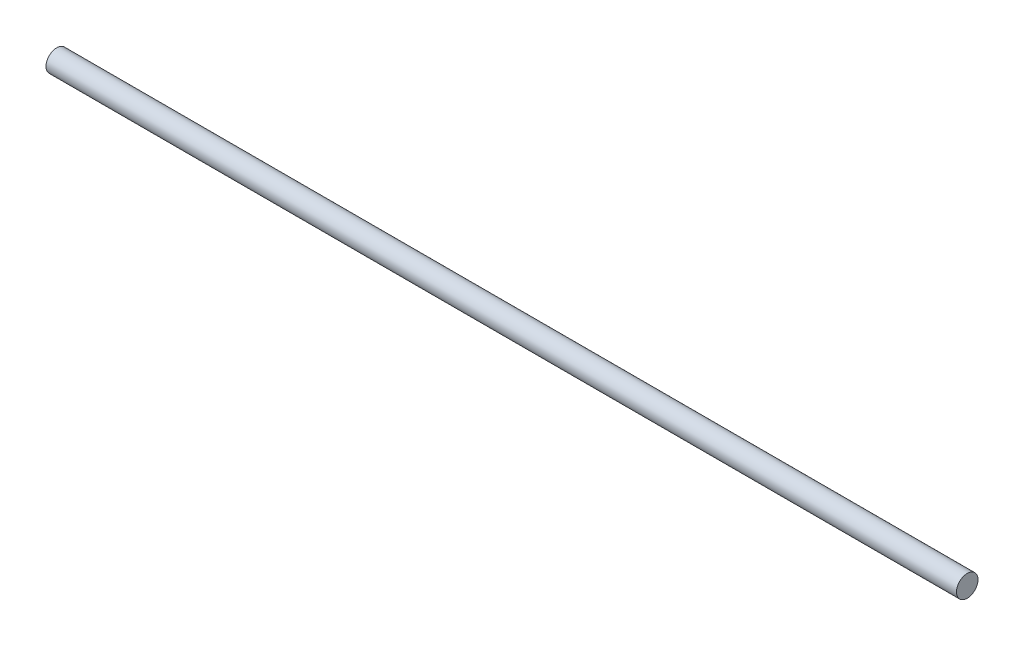
ISO-10303-21;
HEADER;
FILE_DESCRIPTION(('STEP AP214'),'2;1');
FILE_NAME('part.step','',(''),(''),'','','');
FILE_SCHEMA(('AUTOMOTIVE_DESIGN { 1 0 10303 214 1 1 1 1 }'));
ENDSEC;
DATA;
#1=APPLICATION_CONTEXT('core data for automotive mechanical design processes');
#2=APPLICATION_PROTOCOL_DEFINITION('international standard','automotive_design',2000,#1);
#3=PRODUCT_CONTEXT('',#1,'mechanical');
#4=PRODUCT('Part','Part','',(#3));
#5=PRODUCT_RELATED_PRODUCT_CATEGORY('part','',(#4));
#6=PRODUCT_DEFINITION_FORMATION('','',#4);
#7=PRODUCT_DEFINITION_CONTEXT('part definition',#1,'design');
#8=PRODUCT_DEFINITION('design','',#6,#7);
#9=PRODUCT_DEFINITION_SHAPE('','',#8);
#10=(LENGTH_UNIT() NAMED_UNIT(*) SI_UNIT(.MILLI.,.METRE.));
#11=(NAMED_UNIT(*) PLANE_ANGLE_UNIT() SI_UNIT($,.RADIAN.));
#12=(NAMED_UNIT(*) SI_UNIT($,.STERADIAN.) SOLID_ANGLE_UNIT());
#13=UNCERTAINTY_MEASURE_WITH_UNIT(LENGTH_MEASURE(1.E-05),#10,'distance_accuracy_value','');
#14=(GEOMETRIC_REPRESENTATION_CONTEXT(3) GLOBAL_UNCERTAINTY_ASSIGNED_CONTEXT((#13)) GLOBAL_UNIT_ASSIGNED_CONTEXT((#10,
#11,#12)) REPRESENTATION_CONTEXT('',''));
#15=CARTESIAN_POINT('',(0.,0.,0.));
#16=DIRECTION('',(0.,0.,1.));
#17=DIRECTION('',(1.,0.,0.));
#18=AXIS2_PLACEMENT_3D('',#15,#16,#17);
#19=CARTESIAN_POINT('',(338.,0.,0.));
#20=DIRECTION('',(-1.,0.,0.));
#21=DIRECTION('',(0.,0.,1.));
#22=AXIS2_PLACEMENT_3D('',#19,#20,#21);
#23=CYLINDRICAL_SURFACE('',#22,4.);
#24=CARTESIAN_POINT('',(338.,0.,0.));
#25=DIRECTION('',(1.,0.,0.));
#26=DIRECTION('',(0.,0.,-1.));
#27=AXIS2_PLACEMENT_3D('',#24,#25,#26);
#28=CIRCLE('',#27,4.);
#29=CARTESIAN_POINT('',(338.,0.,-4.));
#30=VERTEX_POINT('',#29);
#31=EDGE_CURVE('E10',#30,#30,#28,.T.);
#32=ORIENTED_EDGE('',*,*,#31,.F.);
#33=EDGE_LOOP('',(#32));
#34=FACE_BOUND('',#33,.T.);
#35=CARTESIAN_POINT('',(0.,0.,0.));
#36=DIRECTION('',(1.,0.,0.));
#37=DIRECTION('',(0.,0.,-1.));
#38=AXIS2_PLACEMENT_3D('',#35,#36,#37);
#39=CIRCLE('',#38,4.);
#40=CARTESIAN_POINT('',(0.,0.,-4.));
#41=VERTEX_POINT('',#40);
#42=EDGE_CURVE('E36',#41,#41,#39,.T.);
#43=ORIENTED_EDGE('',*,*,#42,.T.);
#44=EDGE_LOOP('',(#43));
#45=FACE_BOUND('',#44,.T.);
#46=ADVANCED_FACE('F33',(#34,#45),#23,.T.);
#47=CARTESIAN_POINT('',(338.,0.,0.));
#48=DIRECTION('',(1.,0.,0.));
#49=DIRECTION('',(0.,0.,-1.));
#50=AXIS2_PLACEMENT_3D('',#47,#48,#49);
#51=PLANE('',#50);
#52=ORIENTED_EDGE('',*,*,#31,.T.);
#53=EDGE_LOOP('',(#52));
#54=FACE_BOUND('',#53,.T.);
#55=ADVANCED_FACE('F48',(#54),#51,.T.);
#56=CARTESIAN_POINT('',(0.,0.,0.));
#57=DIRECTION('',(1.,0.,0.));
#58=DIRECTION('',(0.,0.,-1.));
#59=AXIS2_PLACEMENT_3D('',#56,#57,#58);
#60=PLANE('',#59);
#61=ORIENTED_EDGE('',*,*,#42,.F.);
#62=EDGE_LOOP('',(#61));
#63=FACE_BOUND('',#62,.T.);
#64=ADVANCED_FACE('F46',(#63),#60,.F.);
#65=CLOSED_SHELL('',(#46,#55,#64));
#66=MANIFOLD_SOLID_BREP('B2',#65);
#67=ADVANCED_BREP_SHAPE_REPRESENTATION('',(#18,#66),#14);
#68=SHAPE_DEFINITION_REPRESENTATION(#9,#67);
ENDSEC;
END-ISO-10303-21;
